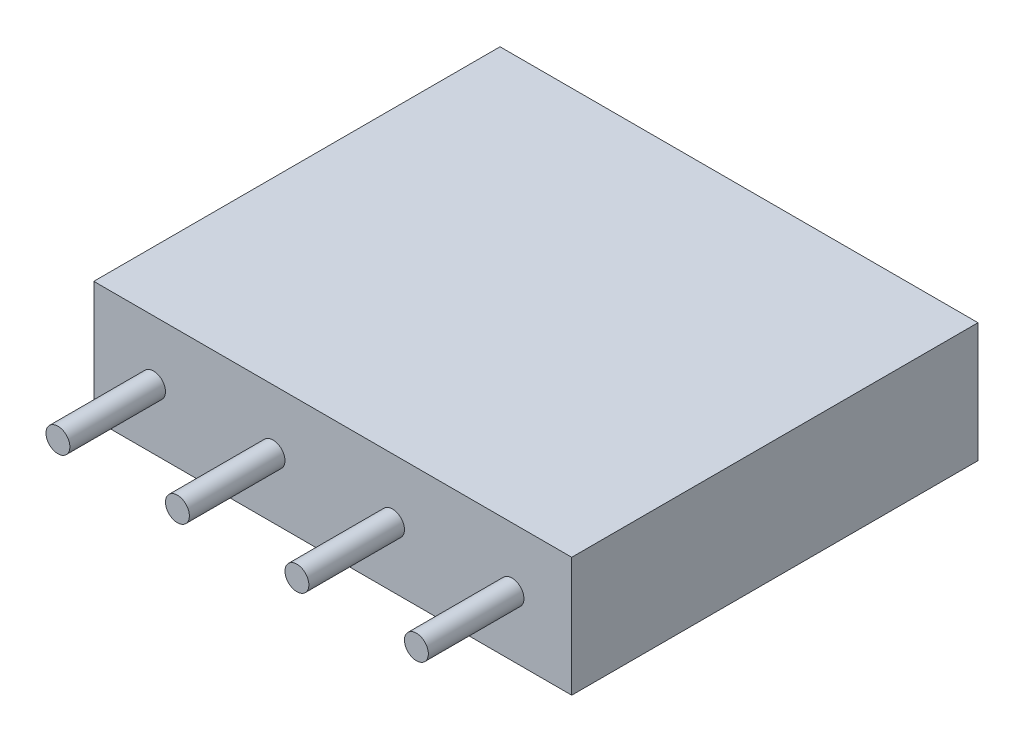
ISO-10303-21;
HEADER;
FILE_DESCRIPTION(('STEP AP214'),'2;1');
FILE_NAME('part.step','',(''),(''),'','','');
FILE_SCHEMA(('AUTOMOTIVE_DESIGN { 1 0 10303 214 1 1 1 1 }'));
ENDSEC;
DATA;
#1=APPLICATION_CONTEXT('core data for automotive mechanical design processes');
#2=APPLICATION_PROTOCOL_DEFINITION('international standard','automotive_design',2000,#1);
#3=PRODUCT_CONTEXT('',#1,'mechanical');
#4=PRODUCT('Part','Part','',(#3));
#5=PRODUCT_RELATED_PRODUCT_CATEGORY('part','',(#4));
#6=PRODUCT_DEFINITION_FORMATION('','',#4);
#7=PRODUCT_DEFINITION_CONTEXT('part definition',#1,'design');
#8=PRODUCT_DEFINITION('design','',#6,#7);
#9=PRODUCT_DEFINITION_SHAPE('','',#8);
#10=(LENGTH_UNIT() NAMED_UNIT(*) SI_UNIT(.MILLI.,.METRE.));
#11=(NAMED_UNIT(*) PLANE_ANGLE_UNIT() SI_UNIT($,.RADIAN.));
#12=(NAMED_UNIT(*) SI_UNIT($,.STERADIAN.) SOLID_ANGLE_UNIT());
#13=UNCERTAINTY_MEASURE_WITH_UNIT(LENGTH_MEASURE(1.E-05),#10,'distance_accuracy_value','');
#14=(GEOMETRIC_REPRESENTATION_CONTEXT(3) GLOBAL_UNCERTAINTY_ASSIGNED_CONTEXT((#13)) GLOBAL_UNIT_ASSIGNED_CONTEXT((#10,
#11,#12)) REPRESENTATION_CONTEXT('',''));
#15=CARTESIAN_POINT('',(0.,0.,0.));
#16=DIRECTION('',(0.,0.,1.));
#17=DIRECTION('',(1.,0.,0.));
#18=AXIS2_PLACEMENT_3D('',#15,#16,#17);
#19=CARTESIAN_POINT('',(-8.75,1.25,10.5));
#20=DIRECTION('',(0.,0.,1.));
#21=DIRECTION('',(1.,0.,0.));
#22=AXIS2_PLACEMENT_3D('',#19,#20,#21);
#23=PLANE('',#22);
#24=CARTESIAN_POINT('',(-8.75,1.25,10.5));
#25=DIRECTION('',(0.,0.,1.));
#26=DIRECTION('',(1.,0.,0.));
#27=AXIS2_PLACEMENT_3D('',#24,#25,#26);
#28=CIRCLE('',#27,0.25);
#29=CARTESIAN_POINT('',(-8.5,1.25,10.5));
#30=VERTEX_POINT('',#29);
#31=EDGE_CURVE('E11',#30,#30,#28,.T.);
#32=ORIENTED_EDGE('',*,*,#31,.T.);
#33=EDGE_LOOP('',(#32));
#34=FACE_BOUND('',#33,.T.);
#35=ADVANCED_FACE('F33',(#34),#23,.T.);
#36=CARTESIAN_POINT('',(-8.75,1.25,10.5));
#37=DIRECTION('',(0.,0.,-1.));
#38=DIRECTION('',(-1.,0.,0.));
#39=AXIS2_PLACEMENT_3D('',#36,#37,#38);
#40=CYLINDRICAL_SURFACE('',#39,0.25);
#41=ORIENTED_EDGE('',*,*,#31,.F.);
#42=EDGE_LOOP('',(#41));
#43=FACE_BOUND('',#42,.T.);
#44=CARTESIAN_POINT('',(-8.75,1.25,8.5));
#45=DIRECTION('',(0.,0.,1.));
#46=DIRECTION('',(1.,0.,0.));
#47=AXIS2_PLACEMENT_3D('',#44,#45,#46);
#48=CIRCLE('',#47,0.25);
#49=CARTESIAN_POINT('',(-8.5,1.25,8.5));
#50=VERTEX_POINT('',#49);
#51=EDGE_CURVE('E41',#50,#50,#48,.T.);
#52=ORIENTED_EDGE('',*,*,#51,.T.);
#53=EDGE_LOOP('',(#52));
#54=FACE_BOUND('',#53,.T.);
#55=ADVANCED_FACE('F129',(#43,#54),#40,.T.);
#56=CARTESIAN_POINT('',(-6.25,1.25,10.5));
#57=DIRECTION('',(0.,0.,1.));
#58=DIRECTION('',(1.,0.,0.));
#59=AXIS2_PLACEMENT_3D('',#56,#57,#58);
#60=PLANE('',#59);
#61=CARTESIAN_POINT('',(-6.25,1.25,10.5));
#62=DIRECTION('',(0.,0.,1.));
#63=DIRECTION('',(1.,0.,0.));
#64=AXIS2_PLACEMENT_3D('',#61,#62,#63);
#65=CIRCLE('',#64,0.25);
#66=CARTESIAN_POINT('',(-6.,1.25,10.5));
#67=VERTEX_POINT('',#66);
#68=EDGE_CURVE('E124',#67,#67,#65,.T.);
#69=ORIENTED_EDGE('',*,*,#68,.T.);
#70=EDGE_LOOP('',(#69));
#71=FACE_BOUND('',#70,.T.);
#72=ADVANCED_FACE('F152',(#71),#60,.T.);
#73=CARTESIAN_POINT('',(-6.25,1.25,10.5));
#74=DIRECTION('',(0.,0.,-1.));
#75=DIRECTION('',(-1.,0.,0.));
#76=AXIS2_PLACEMENT_3D('',#73,#74,#75);
#77=CYLINDRICAL_SURFACE('',#76,0.25);
#78=ORIENTED_EDGE('',*,*,#68,.F.);
#79=EDGE_LOOP('',(#78));
#80=FACE_BOUND('',#79,.T.);
#81=CARTESIAN_POINT('',(-6.25,1.25,8.5));
#82=DIRECTION('',(0.,0.,1.));
#83=DIRECTION('',(1.,0.,0.));
#84=AXIS2_PLACEMENT_3D('',#81,#82,#83);
#85=CIRCLE('',#84,0.25);
#86=CARTESIAN_POINT('',(-6.,1.25,8.5));
#87=VERTEX_POINT('',#86);
#88=EDGE_CURVE('E121',#87,#87,#85,.T.);
#89=ORIENTED_EDGE('',*,*,#88,.T.);
#90=EDGE_LOOP('',(#89));
#91=FACE_BOUND('',#90,.T.);
#92=ADVANCED_FACE('F158',(#80,#91),#77,.T.);
#93=CARTESIAN_POINT('',(0.,0.,8.5));
#94=DIRECTION('',(-1.,0.,0.));
#95=DIRECTION('',(0.,0.,1.));
#96=AXIS2_PLACEMENT_3D('',#93,#94,#95);
#97=PLANE('',#96);
#98=DIRECTION('',(0.,1.,0.));
#99=VECTOR('',#98,1.);
#100=CARTESIAN_POINT('',(0.,0.,0.));
#101=LINE('',#100,#99);
#102=CARTESIAN_POINT('',(0.,0.,0.));
#103=VERTEX_POINT('',#102);
#104=CARTESIAN_POINT('',(0.,2.5,0.));
#105=VERTEX_POINT('',#104);
#106=EDGE_CURVE('E79',#103,#105,#101,.T.);
#107=ORIENTED_EDGE('',*,*,#106,.T.);
#108=DIRECTION('',(0.,0.,-1.));
#109=VECTOR('',#108,1.);
#110=CARTESIAN_POINT('',(0.,2.5,8.5));
#111=LINE('',#110,#109);
#112=CARTESIAN_POINT('',(0.,2.5,8.5));
#113=VERTEX_POINT('',#112);
#114=EDGE_CURVE('E119',#113,#105,#111,.T.);
#115=ORIENTED_EDGE('',*,*,#114,.F.);
#116=DIRECTION('',(0.,1.,0.));
#117=VECTOR('',#116,1.);
#118=CARTESIAN_POINT('',(0.,0.,8.5));
#119=LINE('',#118,#117);
#120=CARTESIAN_POINT('',(0.,0.,8.5));
#121=VERTEX_POINT('',#120);
#122=EDGE_CURVE('E81',#121,#113,#119,.T.);
#123=ORIENTED_EDGE('',*,*,#122,.F.);
#124=DIRECTION('',(0.,0.,-1.));
#125=VECTOR('',#124,1.);
#126=CARTESIAN_POINT('',(0.,0.,8.5));
#127=LINE('',#126,#125);
#128=EDGE_CURVE('E115',#121,#103,#127,.T.);
#129=ORIENTED_EDGE('',*,*,#128,.T.);
#130=EDGE_LOOP('',(#107,#115,#123,#129));
#131=FACE_BOUND('',#130,.T.);
#132=ADVANCED_FACE('F164',(#131),#97,.F.);
#133=CARTESIAN_POINT('',(0.,2.5,8.5));
#134=DIRECTION('',(0.,-1.,0.));
#135=DIRECTION('',(1.,0.,0.));
#136=AXIS2_PLACEMENT_3D('',#133,#134,#135);
#137=PLANE('',#136);
#138=DIRECTION('',(-1.,0.,0.));
#139=VECTOR('',#138,1.);
#140=CARTESIAN_POINT('',(0.,2.5,0.));
#141=LINE('',#140,#139);
#142=CARTESIAN_POINT('',(-10.,2.5,0.));
#143=VERTEX_POINT('',#142);
#144=EDGE_CURVE('E61',#105,#143,#141,.T.);
#145=ORIENTED_EDGE('',*,*,#144,.T.);
#146=DIRECTION('',(0.,0.,-1.));
#147=VECTOR('',#146,1.);
#148=CARTESIAN_POINT('',(-10.,2.5,8.5));
#149=LINE('',#148,#147);
#150=CARTESIAN_POINT('',(-10.,2.5,8.5));
#151=VERTEX_POINT('',#150);
#152=EDGE_CURVE('E90',#151,#143,#149,.T.);
#153=ORIENTED_EDGE('',*,*,#152,.F.);
#154=DIRECTION('',(-1.,0.,0.));
#155=VECTOR('',#154,1.);
#156=CARTESIAN_POINT('',(0.,2.5,8.5));
#157=LINE('',#156,#155);
#158=EDGE_CURVE('E112',#113,#151,#157,.T.);
#159=ORIENTED_EDGE('',*,*,#158,.F.);
#160=ORIENTED_EDGE('',*,*,#114,.T.);
#161=EDGE_LOOP('',(#145,#153,#159,#160));
#162=FACE_BOUND('',#161,.T.);
#163=ADVANCED_FACE('F142',(#162),#137,.F.);
#164=CARTESIAN_POINT('',(0.,0.,8.5));
#165=DIRECTION('',(0.,1.,0.));
#166=DIRECTION('',(0.,0.,1.));
#167=AXIS2_PLACEMENT_3D('',#164,#165,#166);
#168=PLANE('',#167);
#169=DIRECTION('',(1.,0.,0.));
#170=VECTOR('',#169,1.);
#171=CARTESIAN_POINT('',(0.,0.,0.));
#172=LINE('',#171,#170);
#173=CARTESIAN_POINT('',(-10.,0.,0.));
#174=VERTEX_POINT('',#173);
#175=EDGE_CURVE('E74',#174,#103,#172,.T.);
#176=ORIENTED_EDGE('',*,*,#175,.T.);
#177=ORIENTED_EDGE('',*,*,#128,.F.);
#178=DIRECTION('',(1.,0.,0.));
#179=VECTOR('',#178,1.);
#180=CARTESIAN_POINT('',(0.,0.,8.5));
#181=LINE('',#180,#179);
#182=CARTESIAN_POINT('',(-10.,0.,8.5));
#183=VERTEX_POINT('',#182);
#184=EDGE_CURVE('E49',#183,#121,#181,.T.);
#185=ORIENTED_EDGE('',*,*,#184,.F.);
#186=DIRECTION('',(0.,0.,-1.));
#187=VECTOR('',#186,1.);
#188=CARTESIAN_POINT('',(-10.,0.,8.5));
#189=LINE('',#188,#187);
#190=EDGE_CURVE('E88',#183,#174,#189,.T.);
#191=ORIENTED_EDGE('',*,*,#190,.T.);
#192=EDGE_LOOP('',(#176,#177,#185,#191));
#193=FACE_BOUND('',#192,.T.);
#194=ADVANCED_FACE('F94',(#193),#168,.F.);
#195=CARTESIAN_POINT('',(0.,0.,8.5));
#196=DIRECTION('',(0.,0.,1.));
#197=DIRECTION('',(1.,0.,0.));
#198=AXIS2_PLACEMENT_3D('',#195,#196,#197);
#199=PLANE('',#198);
#200=CARTESIAN_POINT('',(-3.75,1.25,8.5));
#201=DIRECTION('',(0.,0.,1.));
#202=DIRECTION('',(1.,0.,0.));
#203=AXIS2_PLACEMENT_3D('',#200,#201,#202);
#204=CIRCLE('',#203,0.25);
#205=CARTESIAN_POINT('',(-3.5,1.25,8.5));
#206=VERTEX_POINT('',#205);
#207=EDGE_CURVE('E372',#206,#206,#204,.T.);
#208=ORIENTED_EDGE('',*,*,#207,.F.);
#209=EDGE_LOOP('',(#208));
#210=FACE_BOUND('',#209,.T.);
#211=CARTESIAN_POINT('',(-1.25,1.25,8.5));
#212=DIRECTION('',(0.,0.,1.));
#213=DIRECTION('',(1.,0.,0.));
#214=AXIS2_PLACEMENT_3D('',#211,#212,#213);
#215=CIRCLE('',#214,0.25);
#216=CARTESIAN_POINT('',(-1.,1.25,8.5));
#217=VERTEX_POINT('',#216);
#218=EDGE_CURVE('E103',#217,#217,#215,.T.);
#219=ORIENTED_EDGE('',*,*,#218,.F.);
#220=EDGE_LOOP('',(#219));
#221=FACE_BOUND('',#220,.T.);
#222=ORIENTED_EDGE('',*,*,#122,.T.);
#223=ORIENTED_EDGE('',*,*,#158,.T.);
#224=DIRECTION('',(0.,-1.,0.));
#225=VECTOR('',#224,1.);
#226=CARTESIAN_POINT('',(-10.,0.,8.5));
#227=LINE('',#226,#225);
#228=EDGE_CURVE('E91',#151,#183,#227,.T.);
#229=ORIENTED_EDGE('',*,*,#228,.T.);
#230=ORIENTED_EDGE('',*,*,#184,.T.);
#231=EDGE_LOOP('',(#222,#223,#229,#230));
#232=FACE_BOUND('',#231,.T.);
#233=ORIENTED_EDGE('',*,*,#88,.F.);
#234=EDGE_LOOP('',(#233));
#235=FACE_BOUND('',#234,.T.);
#236=ORIENTED_EDGE('',*,*,#51,.F.);
#237=EDGE_LOOP('',(#236));
#238=FACE_BOUND('',#237,.T.);
#239=ADVANCED_FACE('F131',(#210,#221,#232,#235,#238),#199,.T.);
#240=CARTESIAN_POINT('',(0.,0.,0.));
#241=DIRECTION('',(0.,0.,1.));
#242=DIRECTION('',(1.,0.,0.));
#243=AXIS2_PLACEMENT_3D('',#240,#241,#242);
#244=PLANE('',#243);
#245=CARTESIAN_POINT('',(-3.75,1.25,0.));
#246=DIRECTION('',(0.,0.,-1.));
#247=DIRECTION('',(-1.,0.,0.));
#248=AXIS2_PLACEMENT_3D('',#245,#246,#247);
#249=CIRCLE('',#248,0.25);
#250=CARTESIAN_POINT('',(-4.,1.25,0.));
#251=VERTEX_POINT('',#250);
#252=EDGE_CURVE('E373',#251,#251,#249,.T.);
#253=ORIENTED_EDGE('',*,*,#252,.F.);
#254=EDGE_LOOP('',(#253));
#255=FACE_BOUND('',#254,.T.);
#256=CARTESIAN_POINT('',(-6.25,1.25,0.));
#257=DIRECTION('',(0.,0.,-1.));
#258=DIRECTION('',(-1.,0.,0.));
#259=AXIS2_PLACEMENT_3D('',#256,#257,#258);
#260=CIRCLE('',#259,0.25);
#261=CARTESIAN_POINT('',(-6.5,1.25,0.));
#262=VERTEX_POINT('',#261);
#263=EDGE_CURVE('E383',#262,#262,#260,.T.);
#264=ORIENTED_EDGE('',*,*,#263,.F.);
#265=EDGE_LOOP('',(#264));
#266=FACE_BOUND('',#265,.T.);
#267=CARTESIAN_POINT('',(-8.75,1.25,0.));
#268=DIRECTION('',(0.,0.,-1.));
#269=DIRECTION('',(-1.,0.,0.));
#270=AXIS2_PLACEMENT_3D('',#267,#268,#269);
#271=CIRCLE('',#270,0.25);
#272=CARTESIAN_POINT('',(-9.,1.25,0.));
#273=VERTEX_POINT('',#272);
#274=EDGE_CURVE('E389',#273,#273,#271,.T.);
#275=ORIENTED_EDGE('',*,*,#274,.F.);
#276=EDGE_LOOP('',(#275));
#277=FACE_BOUND('',#276,.T.);
#278=CARTESIAN_POINT('',(-1.25,1.25,0.));
#279=DIRECTION('',(0.,0.,-1.));
#280=DIRECTION('',(-1.,0.,0.));
#281=AXIS2_PLACEMENT_3D('',#278,#279,#280);
#282=CIRCLE('',#281,0.25);
#283=CARTESIAN_POINT('',(-1.5,1.25,0.));
#284=VERTEX_POINT('',#283);
#285=EDGE_CURVE('E96',#284,#284,#282,.T.);
#286=ORIENTED_EDGE('',*,*,#285,.F.);
#287=EDGE_LOOP('',(#286));
#288=FACE_BOUND('',#287,.T.);
#289=ORIENTED_EDGE('',*,*,#106,.F.);
#290=ORIENTED_EDGE('',*,*,#175,.F.);
#291=DIRECTION('',(0.,-1.,0.));
#292=VECTOR('',#291,1.);
#293=CARTESIAN_POINT('',(-10.,0.,0.));
#294=LINE('',#293,#292);
#295=EDGE_CURVE('E77',#143,#174,#294,.T.);
#296=ORIENTED_EDGE('',*,*,#295,.F.);
#297=ORIENTED_EDGE('',*,*,#144,.F.);
#298=EDGE_LOOP('',(#289,#290,#296,#297));
#299=FACE_BOUND('',#298,.T.);
#300=ADVANCED_FACE('F76',(#255,#266,#277,#288,#299),#244,.F.);
#301=CARTESIAN_POINT('',(-1.25,1.25,10.5));
#302=DIRECTION('',(0.,0.,-1.));
#303=DIRECTION('',(-1.,0.,0.));
#304=AXIS2_PLACEMENT_3D('',#301,#302,#303);
#305=CYLINDRICAL_SURFACE('',#304,0.25);
#306=CARTESIAN_POINT('',(-1.25,1.25,10.5));
#307=DIRECTION('',(0.,0.,1.));
#308=DIRECTION('',(1.,0.,0.));
#309=AXIS2_PLACEMENT_3D('',#306,#307,#308);
#310=CIRCLE('',#309,0.25);
#311=CARTESIAN_POINT('',(-1.,1.25,10.5));
#312=VERTEX_POINT('',#311);
#313=EDGE_CURVE('E106',#312,#312,#310,.T.);
#314=ORIENTED_EDGE('',*,*,#313,.F.);
#315=EDGE_LOOP('',(#314));
#316=FACE_BOUND('',#315,.T.);
#317=ORIENTED_EDGE('',*,*,#218,.T.);
#318=EDGE_LOOP('',(#317));
#319=FACE_BOUND('',#318,.T.);
#320=ADVANCED_FACE('F139',(#316,#319),#305,.T.);
#321=CARTESIAN_POINT('',(-1.25,1.25,10.5));
#322=DIRECTION('',(0.,0.,1.));
#323=DIRECTION('',(1.,0.,0.));
#324=AXIS2_PLACEMENT_3D('',#321,#322,#323);
#325=PLANE('',#324);
#326=ORIENTED_EDGE('',*,*,#313,.T.);
#327=EDGE_LOOP('',(#326));
#328=FACE_BOUND('',#327,.T.);
#329=ADVANCED_FACE('F302',(#328),#325,.T.);
#330=CARTESIAN_POINT('',(-1.25,1.25,4.));
#331=DIRECTION('',(0.,0.,-1.));
#332=DIRECTION('',(-1.,0.,0.));
#333=AXIS2_PLACEMENT_3D('',#330,#331,#332);
#334=CYLINDRICAL_SURFACE('',#333,0.25);
#335=CARTESIAN_POINT('',(-1.25,1.25,4.));
#336=DIRECTION('',(0.,0.,-1.));
#337=DIRECTION('',(-1.,0.,0.));
#338=AXIS2_PLACEMENT_3D('',#335,#336,#337);
#339=CIRCLE('',#338,0.25);
#340=CARTESIAN_POINT('',(-1.5,1.25,4.));
#341=VERTEX_POINT('',#340);
#342=EDGE_CURVE('E100',#341,#341,#339,.T.);
#343=ORIENTED_EDGE('',*,*,#342,.F.);
#344=EDGE_LOOP('',(#343));
#345=FACE_BOUND('',#344,.T.);
#346=ORIENTED_EDGE('',*,*,#285,.T.);
#347=EDGE_LOOP('',(#346));
#348=FACE_BOUND('',#347,.T.);
#349=ADVANCED_FACE('F298',(#345,#348),#334,.F.);
#350=CARTESIAN_POINT('',(-1.25,1.25,4.));
#351=DIRECTION('',(0.,0.,-1.));
#352=DIRECTION('',(-1.,0.,0.));
#353=AXIS2_PLACEMENT_3D('',#350,#351,#352);
#354=PLANE('',#353);
#355=ORIENTED_EDGE('',*,*,#342,.T.);
#356=EDGE_LOOP('',(#355));
#357=FACE_BOUND('',#356,.T.);
#358=ADVANCED_FACE('F209',(#357),#354,.T.);
#359=CARTESIAN_POINT('',(-10.,0.,8.5));
#360=DIRECTION('',(1.,0.,0.));
#361=DIRECTION('',(0.,0.,-1.));
#362=AXIS2_PLACEMENT_3D('',#359,#360,#361);
#363=PLANE('',#362);
#364=ORIENTED_EDGE('',*,*,#295,.T.);
#365=ORIENTED_EDGE('',*,*,#190,.F.);
#366=ORIENTED_EDGE('',*,*,#228,.F.);
#367=ORIENTED_EDGE('',*,*,#152,.T.);
#368=EDGE_LOOP('',(#364,#365,#366,#367));
#369=FACE_BOUND('',#368,.T.);
#370=ADVANCED_FACE('F86',(#369),#363,.F.);
#371=CARTESIAN_POINT('',(-3.75,1.25,10.5));
#372=DIRECTION('',(0.,0.,-1.));
#373=DIRECTION('',(-1.,0.,0.));
#374=AXIS2_PLACEMENT_3D('',#371,#372,#373);
#375=CYLINDRICAL_SURFACE('',#374,0.25);
#376=CARTESIAN_POINT('',(-3.75,1.25,10.5));
#377=DIRECTION('',(0.,0.,1.));
#378=DIRECTION('',(1.,0.,0.));
#379=AXIS2_PLACEMENT_3D('',#376,#377,#378);
#380=CIRCLE('',#379,0.25);
#381=CARTESIAN_POINT('',(-3.5,1.25,10.5));
#382=VERTEX_POINT('',#381);
#383=EDGE_CURVE('E92',#382,#382,#380,.T.);
#384=ORIENTED_EDGE('',*,*,#383,.F.);
#385=EDGE_LOOP('',(#384));
#386=FACE_BOUND('',#385,.T.);
#387=ORIENTED_EDGE('',*,*,#207,.T.);
#388=EDGE_LOOP('',(#387));
#389=FACE_BOUND('',#388,.T.);
#390=ADVANCED_FACE('F208',(#386,#389),#375,.T.);
#391=CARTESIAN_POINT('',(-3.75,1.25,10.5));
#392=DIRECTION('',(0.,0.,1.));
#393=DIRECTION('',(1.,0.,0.));
#394=AXIS2_PLACEMENT_3D('',#391,#392,#393);
#395=PLANE('',#394);
#396=ORIENTED_EDGE('',*,*,#383,.T.);
#397=EDGE_LOOP('',(#396));
#398=FACE_BOUND('',#397,.T.);
#399=ADVANCED_FACE('F220',(#398),#395,.T.);
#400=CARTESIAN_POINT('',(-8.75,1.25,4.));
#401=DIRECTION('',(0.,0.,-1.));
#402=DIRECTION('',(-1.,0.,0.));
#403=AXIS2_PLACEMENT_3D('',#400,#401,#402);
#404=CYLINDRICAL_SURFACE('',#403,0.25);
#405=CARTESIAN_POINT('',(-8.75,1.25,4.));
#406=DIRECTION('',(0.,0.,-1.));
#407=DIRECTION('',(-1.,0.,0.));
#408=AXIS2_PLACEMENT_3D('',#405,#406,#407);
#409=CIRCLE('',#408,0.25);
#410=CARTESIAN_POINT('',(-9.,1.25,4.));
#411=VERTEX_POINT('',#410);
#412=EDGE_CURVE('E386',#411,#411,#409,.T.);
#413=ORIENTED_EDGE('',*,*,#412,.F.);
#414=EDGE_LOOP('',(#413));
#415=FACE_BOUND('',#414,.T.);
#416=ORIENTED_EDGE('',*,*,#274,.T.);
#417=EDGE_LOOP('',(#416));
#418=FACE_BOUND('',#417,.T.);
#419=ADVANCED_FACE('F231',(#415,#418),#404,.F.);
#420=CARTESIAN_POINT('',(-8.75,1.25,4.));
#421=DIRECTION('',(0.,0.,-1.));
#422=DIRECTION('',(-1.,0.,0.));
#423=AXIS2_PLACEMENT_3D('',#420,#421,#422);
#424=PLANE('',#423);
#425=ORIENTED_EDGE('',*,*,#412,.T.);
#426=EDGE_LOOP('',(#425));
#427=FACE_BOUND('',#426,.T.);
#428=ADVANCED_FACE('F241',(#427),#424,.T.);
#429=CARTESIAN_POINT('',(-6.25,1.25,4.));
#430=DIRECTION('',(0.,0.,-1.));
#431=DIRECTION('',(-1.,0.,0.));
#432=AXIS2_PLACEMENT_3D('',#429,#430,#431);
#433=CYLINDRICAL_SURFACE('',#432,0.25);
#434=CARTESIAN_POINT('',(-6.25,1.25,4.));
#435=DIRECTION('',(0.,0.,-1.));
#436=DIRECTION('',(-1.,0.,0.));
#437=AXIS2_PLACEMENT_3D('',#434,#435,#436);
#438=CIRCLE('',#437,0.25);
#439=CARTESIAN_POINT('',(-6.5,1.25,4.));
#440=VERTEX_POINT('',#439);
#441=EDGE_CURVE('E378',#440,#440,#438,.T.);
#442=ORIENTED_EDGE('',*,*,#441,.F.);
#443=EDGE_LOOP('',(#442));
#444=FACE_BOUND('',#443,.T.);
#445=ORIENTED_EDGE('',*,*,#263,.T.);
#446=EDGE_LOOP('',(#445));
#447=FACE_BOUND('',#446,.T.);
#448=ADVANCED_FACE('F251',(#444,#447),#433,.F.);
#449=CARTESIAN_POINT('',(-6.25,1.25,4.));
#450=DIRECTION('',(0.,0.,-1.));
#451=DIRECTION('',(-1.,0.,0.));
#452=AXIS2_PLACEMENT_3D('',#449,#450,#451);
#453=PLANE('',#452);
#454=ORIENTED_EDGE('',*,*,#441,.T.);
#455=EDGE_LOOP('',(#454));
#456=FACE_BOUND('',#455,.T.);
#457=ADVANCED_FACE('F261',(#456),#453,.T.);
#458=CARTESIAN_POINT('',(-3.75,1.25,4.));
#459=DIRECTION('',(0.,0.,-1.));
#460=DIRECTION('',(-1.,0.,0.));
#461=AXIS2_PLACEMENT_3D('',#458,#459,#460);
#462=CYLINDRICAL_SURFACE('',#461,0.25);
#463=CARTESIAN_POINT('',(-3.75,1.25,4.));
#464=DIRECTION('',(0.,0.,-1.));
#465=DIRECTION('',(-1.,0.,0.));
#466=AXIS2_PLACEMENT_3D('',#463,#464,#465);
#467=CIRCLE('',#466,0.25);
#468=CARTESIAN_POINT('',(-4.,1.25,4.));
#469=VERTEX_POINT('',#468);
#470=EDGE_CURVE('E371',#469,#469,#467,.T.);
#471=ORIENTED_EDGE('',*,*,#470,.F.);
#472=EDGE_LOOP('',(#471));
#473=FACE_BOUND('',#472,.T.);
#474=ORIENTED_EDGE('',*,*,#252,.T.);
#475=EDGE_LOOP('',(#474));
#476=FACE_BOUND('',#475,.T.);
#477=ADVANCED_FACE('F271',(#473,#476),#462,.F.);
#478=CARTESIAN_POINT('',(-3.75,1.25,4.));
#479=DIRECTION('',(0.,0.,-1.));
#480=DIRECTION('',(-1.,0.,0.));
#481=AXIS2_PLACEMENT_3D('',#478,#479,#480);
#482=PLANE('',#481);
#483=ORIENTED_EDGE('',*,*,#470,.T.);
#484=EDGE_LOOP('',(#483));
#485=FACE_BOUND('',#484,.T.);
#486=ADVANCED_FACE('F281',(#485),#482,.T.);
#487=CLOSED_SHELL('',(#35,#55,#72,#92,#132,#163,#194,#239,#300,#320,#329,#349,#358,#370,#390,
#399,#419,#428,#448,#457,#477,#486));
#488=MANIFOLD_SOLID_BREP('B2',#487);
#489=ADVANCED_BREP_SHAPE_REPRESENTATION('',(#18,#488),#14);
#490=SHAPE_DEFINITION_REPRESENTATION(#9,#489);
ENDSEC;
END-ISO-10303-21;
